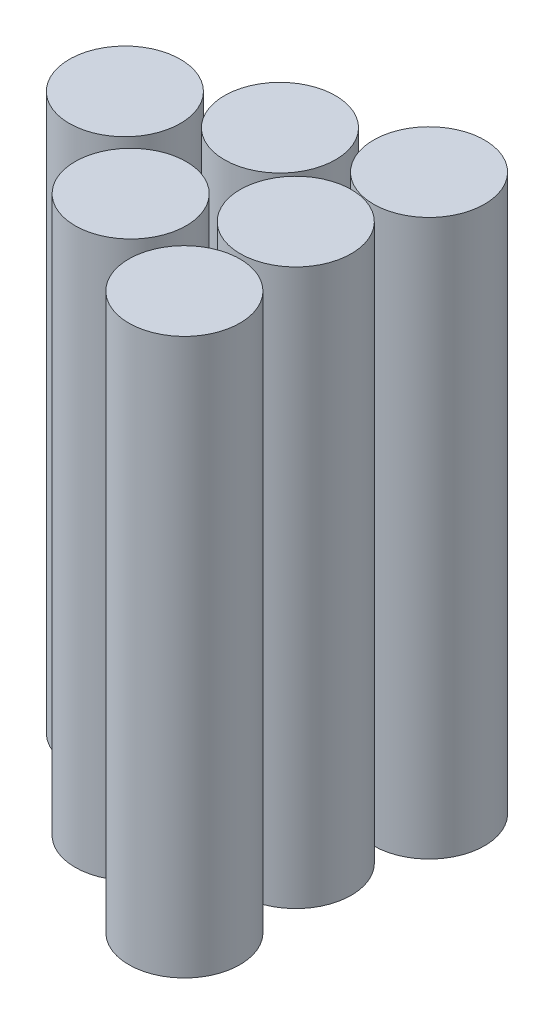
ISO-10303-21;
HEADER;
FILE_DESCRIPTION(('STEP AP214'),'2;1');
FILE_NAME('part.step','',(''),(''),'','','');
FILE_SCHEMA(('AUTOMOTIVE_DESIGN { 1 0 10303 214 1 1 1 1 }'));
ENDSEC;
DATA;
#1=APPLICATION_CONTEXT('core data for automotive mechanical design processes');
#2=APPLICATION_PROTOCOL_DEFINITION('international standard','automotive_design',2000,#1);
#3=PRODUCT_CONTEXT('',#1,'mechanical');
#4=PRODUCT('Part','Part','',(#3));
#5=PRODUCT_RELATED_PRODUCT_CATEGORY('part','',(#4));
#6=PRODUCT_DEFINITION_FORMATION('','',#4);
#7=PRODUCT_DEFINITION_CONTEXT('part definition',#1,'design');
#8=PRODUCT_DEFINITION('design','',#6,#7);
#9=PRODUCT_DEFINITION_SHAPE('','',#8);
#10=(LENGTH_UNIT() NAMED_UNIT(*) SI_UNIT(.MILLI.,.METRE.));
#11=(NAMED_UNIT(*) PLANE_ANGLE_UNIT() SI_UNIT($,.RADIAN.));
#12=(NAMED_UNIT(*) SI_UNIT($,.STERADIAN.) SOLID_ANGLE_UNIT());
#13=UNCERTAINTY_MEASURE_WITH_UNIT(LENGTH_MEASURE(1.E-05),#10,'distance_accuracy_value','');
#14=(GEOMETRIC_REPRESENTATION_CONTEXT(3) GLOBAL_UNCERTAINTY_ASSIGNED_CONTEXT((#13)) GLOBAL_UNIT_ASSIGNED_CONTEXT((#10,
#11,#12)) REPRESENTATION_CONTEXT('',''));
#15=CARTESIAN_POINT('',(0.,0.,0.));
#16=DIRECTION('',(0.,0.,1.));
#17=DIRECTION('',(1.,0.,0.));
#18=AXIS2_PLACEMENT_3D('',#15,#16,#17);
#19=CARTESIAN_POINT('',(0.00998073117925075,1.25,0.260510711016285));
#20=DIRECTION('',(0.,-1.,0.));
#21=DIRECTION('',(0.,0.,-1.));
#22=AXIS2_PLACEMENT_3D('',#19,#20,#21);
#23=CYLINDRICAL_SURFACE('',#22,0.125);
#24=CARTESIAN_POINT('',(0.00998073117925075,1.25,0.260510711016285));
#25=DIRECTION('',(0.,1.,0.));
#26=DIRECTION('',(0.,0.,1.));
#27=AXIS2_PLACEMENT_3D('',#24,#25,#26);
#28=CIRCLE('',#27,0.125);
#29=CARTESIAN_POINT('',(0.00998073117925075,1.25,0.385510711016285));
#30=VERTEX_POINT('',#29);
#31=EDGE_CURVE('E11',#30,#30,#28,.T.);
#32=ORIENTED_EDGE('',*,*,#31,.F.);
#33=EDGE_LOOP('',(#32));
#34=FACE_BOUND('',#33,.T.);
#35=CARTESIAN_POINT('',(0.00998073117925075,0.,0.260510711016285));
#36=DIRECTION('',(0.,1.,0.));
#37=DIRECTION('',(0.,0.,1.));
#38=AXIS2_PLACEMENT_3D('',#35,#36,#37);
#39=CIRCLE('',#38,0.125);
#40=CARTESIAN_POINT('',(0.00998073117925075,0.,0.385510711016285));
#41=VERTEX_POINT('',#40);
#42=EDGE_CURVE('E49',#41,#41,#39,.T.);
#43=ORIENTED_EDGE('',*,*,#42,.T.);
#44=EDGE_LOOP('',(#43));
#45=FACE_BOUND('',#44,.T.);
#46=ADVANCED_FACE('F46',(#34,#45),#23,.T.);
#47=CARTESIAN_POINT('',(0.00998073117925075,1.25,0.260510711016285));
#48=DIRECTION('',(0.,1.,0.));
#49=DIRECTION('',(0.,0.,1.));
#50=AXIS2_PLACEMENT_3D('',#47,#48,#49);
#51=PLANE('',#50);
#52=ORIENTED_EDGE('',*,*,#31,.T.);
#53=EDGE_LOOP('',(#52));
#54=FACE_BOUND('',#53,.T.);
#55=ADVANCED_FACE('F61',(#54),#51,.T.);
#56=CARTESIAN_POINT('',(0.00998073117925075,0.,0.260510711016285));
#57=DIRECTION('',(0.,1.,0.));
#58=DIRECTION('',(0.,0.,1.));
#59=AXIS2_PLACEMENT_3D('',#56,#57,#58);
#60=PLANE('',#59);
#61=ORIENTED_EDGE('',*,*,#42,.F.);
#62=EDGE_LOOP('',(#61));
#63=FACE_BOUND('',#62,.T.);
#64=ADVANCED_FACE('F59',(#63),#60,.F.);
#65=CLOSED_SHELL('',(#46,#55,#64));
#66=MANIFOLD_SOLID_BREP('B2',#65);
#67=CARTESIAN_POINT('',(-0.240156125847811,1.25,0.131235087659791));
#68=DIRECTION('',(0.,-1.,0.));
#69=DIRECTION('',(0.,0.,-1.));
#70=AXIS2_PLACEMENT_3D('',#67,#68,#69);
#71=CYLINDRICAL_SURFACE('',#70,0.125);
#72=CARTESIAN_POINT('',(-0.240156125847811,1.25,0.131235087659791));
#73=DIRECTION('',(0.,1.,0.));
#74=DIRECTION('',(0.,0.,1.));
#75=AXIS2_PLACEMENT_3D('',#72,#73,#74);
#76=CIRCLE('',#75,0.125);
#77=CARTESIAN_POINT('',(-0.240156125847811,1.25,0.256235087659791));
#78=VERTEX_POINT('',#77);
#79=EDGE_CURVE('E45',#78,#78,#76,.T.);
#80=ORIENTED_EDGE('',*,*,#79,.F.);
#81=EDGE_LOOP('',(#80));
#82=FACE_BOUND('',#81,.T.);
#83=CARTESIAN_POINT('',(-0.240156125847811,0.,0.131235087659791));
#84=DIRECTION('',(0.,1.,0.));
#85=DIRECTION('',(0.,0.,1.));
#86=AXIS2_PLACEMENT_3D('',#83,#84,#85);
#87=CIRCLE('',#86,0.125);
#88=CARTESIAN_POINT('',(-0.240156125847811,0.,0.256235087659791));
#89=VERTEX_POINT('',#88);
#90=EDGE_CURVE('E98',#89,#89,#87,.T.);
#91=ORIENTED_EDGE('',*,*,#90,.T.);
#92=EDGE_LOOP('',(#91));
#93=FACE_BOUND('',#92,.T.);
#94=ADVANCED_FACE('F95',(#82,#93),#71,.T.);
#95=CARTESIAN_POINT('',(-0.240156125847811,1.25,0.131235087659791));
#96=DIRECTION('',(0.,1.,0.));
#97=DIRECTION('',(0.,0.,1.));
#98=AXIS2_PLACEMENT_3D('',#95,#96,#97);
#99=PLANE('',#98);
#100=ORIENTED_EDGE('',*,*,#79,.T.);
#101=EDGE_LOOP('',(#100));
#102=FACE_BOUND('',#101,.T.);
#103=ADVANCED_FACE('F110',(#102),#99,.T.);
#104=CARTESIAN_POINT('',(-0.240156125847811,0.,0.131235087659791));
#105=DIRECTION('',(0.,1.,0.));
#106=DIRECTION('',(0.,0.,1.));
#107=AXIS2_PLACEMENT_3D('',#104,#105,#106);
#108=PLANE('',#107);
#109=ORIENTED_EDGE('',*,*,#90,.F.);
#110=EDGE_LOOP('',(#109));
#111=FACE_BOUND('',#110,.T.);
#112=ADVANCED_FACE('F108',(#111),#108,.F.);
#113=CLOSED_SHELL('',(#94,#103,#112));
#114=MANIFOLD_SOLID_BREP('B6',#113);
#115=CARTESIAN_POINT('',(-0.445926200894537,1.25,-0.0615309305995956));
#116=DIRECTION('',(0.,-1.,0.));
#117=DIRECTION('',(0.,0.,-1.));
#118=AXIS2_PLACEMENT_3D('',#115,#116,#117);
#119=CYLINDRICAL_SURFACE('',#118,0.125);
#120=CARTESIAN_POINT('',(-0.445926200894537,1.25,-0.0615309305995956));
#121=DIRECTION('',(0.,1.,0.));
#122=DIRECTION('',(0.,0.,1.));
#123=AXIS2_PLACEMENT_3D('',#120,#121,#122);
#124=CIRCLE('',#123,0.125);
#125=CARTESIAN_POINT('',(-0.445926200894537,1.25,0.0634690694004044));
#126=VERTEX_POINT('',#125);
#127=EDGE_CURVE('E94',#126,#126,#124,.T.);
#128=ORIENTED_EDGE('',*,*,#127,.F.);
#129=EDGE_LOOP('',(#128));
#130=FACE_BOUND('',#129,.T.);
#131=CARTESIAN_POINT('',(-0.445926200894537,0.,-0.0615309305995956));
#132=DIRECTION('',(0.,1.,0.));
#133=DIRECTION('',(0.,0.,1.));
#134=AXIS2_PLACEMENT_3D('',#131,#132,#133);
#135=CIRCLE('',#134,0.125);
#136=CARTESIAN_POINT('',(-0.445926200894537,0.,0.0634690694004044));
#137=VERTEX_POINT('',#136);
#138=EDGE_CURVE('E147',#137,#137,#135,.T.);
#139=ORIENTED_EDGE('',*,*,#138,.T.);
#140=EDGE_LOOP('',(#139));
#141=FACE_BOUND('',#140,.T.);
#142=ADVANCED_FACE('F144',(#130,#141),#119,.T.);
#143=CARTESIAN_POINT('',(-0.445926200894537,1.25,-0.0615309305995956));
#144=DIRECTION('',(0.,1.,0.));
#145=DIRECTION('',(0.,0.,1.));
#146=AXIS2_PLACEMENT_3D('',#143,#144,#145);
#147=PLANE('',#146);
#148=ORIENTED_EDGE('',*,*,#127,.T.);
#149=EDGE_LOOP('',(#148));
#150=FACE_BOUND('',#149,.T.);
#151=ADVANCED_FACE('F161',(#150),#147,.T.);
#152=CARTESIAN_POINT('',(-0.445926200894537,0.,-0.0615309305995956));
#153=DIRECTION('',(0.,1.,0.));
#154=DIRECTION('',(0.,0.,1.));
#155=AXIS2_PLACEMENT_3D('',#152,#153,#154);
#156=PLANE('',#155);
#157=ORIENTED_EDGE('',*,*,#138,.F.);
#158=EDGE_LOOP('',(#157));
#159=FACE_BOUND('',#158,.T.);
#160=ADVANCED_FACE('F159',(#159),#156,.F.);
#161=CLOSED_SHELL('',(#142,#151,#160));
#162=MANIFOLD_SOLID_BREP('B40',#161);
#163=CARTESIAN_POINT('',(0.0534660129265076,1.25,-0.246381959696905));
#164=DIRECTION('',(0.,-1.,0.));
#165=DIRECTION('',(0.,0.,-1.));
#166=AXIS2_PLACEMENT_3D('',#163,#164,#165);
#167=CYLINDRICAL_SURFACE('',#166,0.125);
#168=CARTESIAN_POINT('',(0.0534660129265076,1.25,-0.246381959696905));
#169=DIRECTION('',(0.,1.,0.));
#170=DIRECTION('',(0.,0.,1.));
#171=AXIS2_PLACEMENT_3D('',#168,#169,#170);
#172=CIRCLE('',#171,0.125);
#173=CARTESIAN_POINT('',(0.0534660129265076,1.25,-0.121381959696905));
#174=VERTEX_POINT('',#173);
#175=EDGE_CURVE('E143',#174,#174,#172,.T.);
#176=ORIENTED_EDGE('',*,*,#175,.F.);
#177=EDGE_LOOP('',(#176));
#178=FACE_BOUND('',#177,.T.);
#179=CARTESIAN_POINT('',(0.0534660129265076,0.,-0.246381959696905));
#180=DIRECTION('',(0.,1.,0.));
#181=DIRECTION('',(0.,0.,1.));
#182=AXIS2_PLACEMENT_3D('',#179,#180,#181);
#183=CIRCLE('',#182,0.125);
#184=CARTESIAN_POINT('',(0.0534660129265076,0.,-0.121381959696905));
#185=VERTEX_POINT('',#184);
#186=EDGE_CURVE('E198',#185,#185,#183,.T.);
#187=ORIENTED_EDGE('',*,*,#186,.T.);
#188=EDGE_LOOP('',(#187));
#189=FACE_BOUND('',#188,.T.);
#190=ADVANCED_FACE('F195',(#178,#189),#167,.T.);
#191=CARTESIAN_POINT('',(0.0534660129265076,1.25,-0.246381959696905));
#192=DIRECTION('',(0.,1.,0.));
#193=DIRECTION('',(0.,0.,1.));
#194=AXIS2_PLACEMENT_3D('',#191,#192,#193);
#195=PLANE('',#194);
#196=ORIENTED_EDGE('',*,*,#175,.T.);
#197=EDGE_LOOP('',(#196));
#198=FACE_BOUND('',#197,.T.);
#199=ADVANCED_FACE('F210',(#198),#195,.T.);
#200=CARTESIAN_POINT('',(0.0534660129265076,0.,-0.246381959696905));
#201=DIRECTION('',(0.,1.,0.));
#202=DIRECTION('',(0.,0.,1.));
#203=AXIS2_PLACEMENT_3D('',#200,#201,#202);
#204=PLANE('',#203);
#205=ORIENTED_EDGE('',*,*,#186,.F.);
#206=EDGE_LOOP('',(#205));
#207=FACE_BOUND('',#206,.T.);
#208=ADVANCED_FACE('F208',(#207),#204,.F.);
#209=CLOSED_SHELL('',(#190,#199,#208));
#210=MANIFOLD_SOLID_BREP('B89',#209);
#211=CARTESIAN_POINT('',(-0.200728237790734,1.25,-0.165210686358626));
#212=DIRECTION('',(0.,-1.,0.));
#213=DIRECTION('',(0.,0.,-1.));
#214=AXIS2_PLACEMENT_3D('',#211,#212,#213);
#215=CYLINDRICAL_SURFACE('',#214,0.125);
#216=CARTESIAN_POINT('',(-0.200728237790734,1.25,-0.165210686358626));
#217=DIRECTION('',(0.,1.,0.));
#218=DIRECTION('',(0.,0.,1.));
#219=AXIS2_PLACEMENT_3D('',#216,#217,#218);
#220=CIRCLE('',#219,0.125);
#221=CARTESIAN_POINT('',(-0.200728237790734,1.25,-0.040210686358626));
#222=VERTEX_POINT('',#221);
#223=EDGE_CURVE('E194',#222,#222,#220,.T.);
#224=ORIENTED_EDGE('',*,*,#223,.F.);
#225=EDGE_LOOP('',(#224));
#226=FACE_BOUND('',#225,.T.);
#227=CARTESIAN_POINT('',(-0.200728237790734,0.,-0.165210686358626));
#228=DIRECTION('',(0.,1.,0.));
#229=DIRECTION('',(0.,0.,1.));
#230=AXIS2_PLACEMENT_3D('',#227,#228,#229);
#231=CIRCLE('',#230,0.125);
#232=CARTESIAN_POINT('',(-0.200728237790734,0.,-0.040210686358626));
#233=VERTEX_POINT('',#232);
#234=EDGE_CURVE('E246',#233,#233,#231,.T.);
#235=ORIENTED_EDGE('',*,*,#234,.T.);
#236=EDGE_LOOP('',(#235));
#237=FACE_BOUND('',#236,.T.);
#238=ADVANCED_FACE('F243',(#226,#237),#215,.T.);
#239=CARTESIAN_POINT('',(-0.200728237790734,1.25,-0.165210686358626));
#240=DIRECTION('',(0.,1.,0.));
#241=DIRECTION('',(0.,0.,1.));
#242=AXIS2_PLACEMENT_3D('',#239,#240,#241);
#243=PLANE('',#242);
#244=ORIENTED_EDGE('',*,*,#223,.T.);
#245=EDGE_LOOP('',(#244));
#246=FACE_BOUND('',#245,.T.);
#247=ADVANCED_FACE('F258',(#246),#243,.T.);
#248=CARTESIAN_POINT('',(-0.200728237790734,0.,-0.165210686358626));
#249=DIRECTION('',(0.,1.,0.));
#250=DIRECTION('',(0.,0.,1.));
#251=AXIS2_PLACEMENT_3D('',#248,#249,#250);
#252=PLANE('',#251);
#253=ORIENTED_EDGE('',*,*,#234,.F.);
#254=EDGE_LOOP('',(#253));
#255=FACE_BOUND('',#254,.T.);
#256=ADVANCED_FACE('F256',(#255),#252,.F.);
#257=CLOSED_SHELL('',(#238,#247,#256));
#258=MANIFOLD_SOLID_BREP('B138',#257);
#259=CARTESIAN_POINT('',(0.,1.25,0.));
#260=DIRECTION('',(0.,-1.,0.));
#261=DIRECTION('',(0.,0.,-1.));
#262=AXIS2_PLACEMENT_3D('',#259,#260,#261);
#263=CYLINDRICAL_SURFACE('',#262,0.125);
#264=CARTESIAN_POINT('',(0.,1.25,0.));
#265=DIRECTION('',(0.,1.,0.));
#266=DIRECTION('',(0.,0.,1.));
#267=AXIS2_PLACEMENT_3D('',#264,#265,#266);
#268=CIRCLE('',#267,0.125);
#269=CARTESIAN_POINT('',(0.,1.25,0.125));
#270=VERTEX_POINT('',#269);
#271=EDGE_CURVE('E242',#270,#270,#268,.T.);
#272=ORIENTED_EDGE('',*,*,#271,.F.);
#273=EDGE_LOOP('',(#272));
#274=FACE_BOUND('',#273,.T.);
#275=CARTESIAN_POINT('',(0.,0.,0.));
#276=DIRECTION('',(0.,1.,0.));
#277=DIRECTION('',(0.,0.,1.));
#278=AXIS2_PLACEMENT_3D('',#275,#276,#277);
#279=CIRCLE('',#278,0.125);
#280=CARTESIAN_POINT('',(0.,0.,0.125));
#281=VERTEX_POINT('',#280);
#282=EDGE_CURVE('E287',#281,#281,#279,.T.);
#283=ORIENTED_EDGE('',*,*,#282,.T.);
#284=EDGE_LOOP('',(#283));
#285=FACE_BOUND('',#284,.T.);
#286=ADVANCED_FACE('F284',(#274,#285),#263,.T.);
#287=CARTESIAN_POINT('',(0.,1.25,0.));
#288=DIRECTION('',(0.,1.,0.));
#289=DIRECTION('',(0.,0.,1.));
#290=AXIS2_PLACEMENT_3D('',#287,#288,#289);
#291=PLANE('',#290);
#292=ORIENTED_EDGE('',*,*,#271,.T.);
#293=EDGE_LOOP('',(#292));
#294=FACE_BOUND('',#293,.T.);
#295=ADVANCED_FACE('F299',(#294),#291,.T.);
#296=CARTESIAN_POINT('',(0.,0.,0.));
#297=DIRECTION('',(0.,1.,0.));
#298=DIRECTION('',(0.,0.,1.));
#299=AXIS2_PLACEMENT_3D('',#296,#297,#298);
#300=PLANE('',#299);
#301=ORIENTED_EDGE('',*,*,#282,.F.);
#302=EDGE_LOOP('',(#301));
#303=FACE_BOUND('',#302,.T.);
#304=ADVANCED_FACE('F297',(#303),#300,.F.);
#305=CLOSED_SHELL('',(#286,#295,#304));
#306=MANIFOLD_SOLID_BREP('B189',#305);
#307=ADVANCED_BREP_SHAPE_REPRESENTATION('',(#18,#66,#114,#162,#210,#258,#306),#14);
#308=SHAPE_DEFINITION_REPRESENTATION(#9,#307);
ENDSEC;
END-ISO-10303-21;
